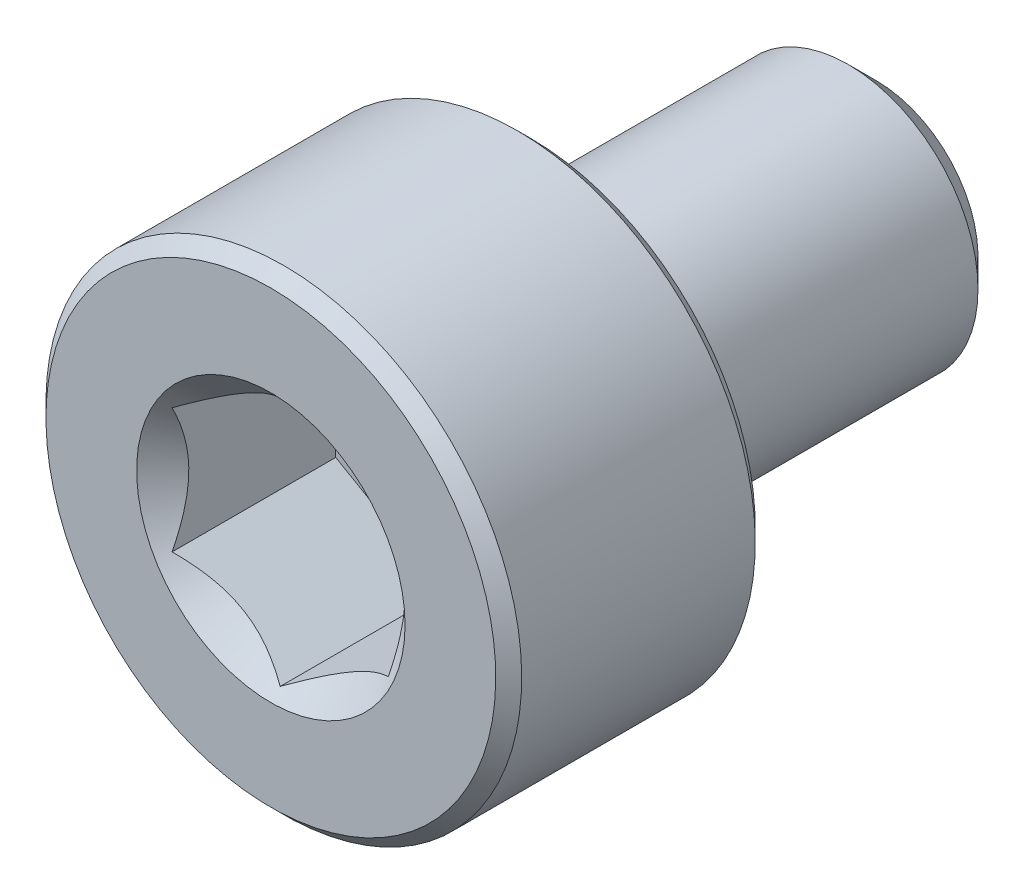
ISO-10303-21;
HEADER;
FILE_DESCRIPTION(('STEP AP214'),'2;1');
FILE_NAME('part.step','',(''),(''),'','','');
FILE_SCHEMA(('AUTOMOTIVE_DESIGN { 1 0 10303 214 1 1 1 1 }'));
ENDSEC;
DATA;
#1=APPLICATION_CONTEXT('core data for automotive mechanical design processes');
#2=APPLICATION_PROTOCOL_DEFINITION('international standard','automotive_design',2000,#1);
#3=PRODUCT_CONTEXT('',#1,'mechanical');
#4=PRODUCT('Part','Part','',(#3));
#5=PRODUCT_RELATED_PRODUCT_CATEGORY('part','',(#4));
#6=PRODUCT_DEFINITION_FORMATION('','',#4);
#7=PRODUCT_DEFINITION_CONTEXT('part definition',#1,'design');
#8=PRODUCT_DEFINITION('design','',#6,#7);
#9=PRODUCT_DEFINITION_SHAPE('','',#8);
#10=(LENGTH_UNIT() NAMED_UNIT(*) SI_UNIT(.MILLI.,.METRE.));
#11=(NAMED_UNIT(*) PLANE_ANGLE_UNIT() SI_UNIT($,.RADIAN.));
#12=(NAMED_UNIT(*) SI_UNIT($,.STERADIAN.) SOLID_ANGLE_UNIT());
#13=UNCERTAINTY_MEASURE_WITH_UNIT(LENGTH_MEASURE(1.E-05),#10,'distance_accuracy_value','');
#14=(GEOMETRIC_REPRESENTATION_CONTEXT(3) GLOBAL_UNCERTAINTY_ASSIGNED_CONTEXT((#13)) GLOBAL_UNIT_ASSIGNED_CONTEXT((#10,
#11,#12)) REPRESENTATION_CONTEXT('',''));
#15=CARTESIAN_POINT('',(0.,0.,0.));
#16=DIRECTION('',(0.,0.,1.));
#17=DIRECTION('',(1.,0.,0.));
#18=AXIS2_PLACEMENT_3D('',#15,#16,#17);
#19=CARTESIAN_POINT('',(0.,1.17524047358084,-3.5));
#20=DIRECTION('',(0.,0.,-1.));
#21=DIRECTION('',(0.,1.,0.));
#22=AXIS2_PLACEMENT_3D('',#19,#20,#21);
#23=PLANE('',#22);
#24=CARTESIAN_POINT('',(0.,0.,-3.5));
#25=DIRECTION('',(0.,0.,-1.));
#26=DIRECTION('',(0.,1.,0.));
#27=AXIS2_PLACEMENT_3D('',#24,#25,#26);
#28=CIRCLE('',#27,1.17524047358084);
#29=CARTESIAN_POINT('',(0.,1.17524047358084,-3.5));
#30=VERTEX_POINT('',#29);
#31=EDGE_CURVE('E55',#30,#30,#28,.T.);
#32=ORIENTED_EDGE('',*,*,#31,.T.);
#33=EDGE_LOOP('',(#32));
#34=FACE_BOUND('',#33,.T.);
#35=ADVANCED_FACE('F41',(#34),#23,.T.);
#36=CARTESIAN_POINT('',(0.,0.,-3.5));
#37=DIRECTION('',(0.,0.,1.));
#38=DIRECTION('',(0.,-1.,0.));
#39=AXIS2_PLACEMENT_3D('',#36,#37,#38);
#40=CONICAL_SURFACE('',#39,1.17524047358084,0.785398163397446);
#41=CARTESIAN_POINT('',(0.,0.,-3.17524047358083));
#42=DIRECTION('',(0.,0.,-1.));
#43=DIRECTION('',(0.,1.,0.));
#44=AXIS2_PLACEMENT_3D('',#41,#42,#43);
#45=CIRCLE('',#44,1.5);
#46=CARTESIAN_POINT('',(0.,1.5,-3.17524047358083));
#47=VERTEX_POINT('',#46);
#48=EDGE_CURVE('E173',#47,#47,#45,.T.);
#49=ORIENTED_EDGE('',*,*,#48,.T.);
#50=EDGE_LOOP('',(#49));
#51=FACE_BOUND('',#50,.T.);
#52=ORIENTED_EDGE('',*,*,#31,.F.);
#53=EDGE_LOOP('',(#52));
#54=FACE_BOUND('',#53,.T.);
#55=ADVANCED_FACE('F181',(#51,#54),#40,.T.);
#56=CARTESIAN_POINT('',(0.,0.,-3.5));
#57=DIRECTION('',(0.,0.,-1.));
#58=DIRECTION('',(0.,1.,0.));
#59=AXIS2_PLACEMENT_3D('',#56,#57,#58);
#60=CYLINDRICAL_SURFACE('',#59,1.5);
#61=CARTESIAN_POINT('',(0.,0.,0.349999999999998));
#62=DIRECTION('',(0.,0.,-1.));
#63=DIRECTION('',(0.,1.,0.));
#64=AXIS2_PLACEMENT_3D('',#61,#62,#63);
#65=CIRCLE('',#64,1.5);
#66=CARTESIAN_POINT('',(0.,1.5,0.349999999999998));
#67=VERTEX_POINT('',#66);
#68=EDGE_CURVE('E169',#67,#67,#65,.T.);
#69=ORIENTED_EDGE('',*,*,#68,.T.);
#70=EDGE_LOOP('',(#69));
#71=FACE_BOUND('',#70,.T.);
#72=ORIENTED_EDGE('',*,*,#48,.F.);
#73=EDGE_LOOP('',(#72));
#74=FACE_BOUND('',#73,.T.);
#75=ADVANCED_FACE('F183',(#71,#74),#60,.T.);
#76=CARTESIAN_POINT('',(0.,0.,0.349999999999998));
#77=DIRECTION('',(0.,0.,-1.));
#78=DIRECTION('',(0.,1.,0.));
#79=AXIS2_PLACEMENT_3D('',#76,#77,#78);
#80=TOROIDAL_SURFACE('',#79,1.65,0.15);
#81=CARTESIAN_POINT('',(0.,0.,0.499999999999999));
#82=DIRECTION('',(0.,0.,-1.));
#83=DIRECTION('',(0.,1.,0.));
#84=AXIS2_PLACEMENT_3D('',#81,#82,#83);
#85=CIRCLE('',#84,1.65);
#86=CARTESIAN_POINT('',(0.,1.65,0.499999999999999));
#87=VERTEX_POINT('',#86);
#88=EDGE_CURVE('E165',#87,#87,#85,.T.);
#89=ORIENTED_EDGE('',*,*,#88,.T.);
#90=EDGE_LOOP('',(#89));
#91=FACE_BOUND('',#90,.T.);
#92=ORIENTED_EDGE('',*,*,#68,.F.);
#93=EDGE_LOOP('',(#92));
#94=FACE_BOUND('',#93,.T.);
#95=ADVANCED_FACE('F189',(#91,#94),#80,.F.);
#96=CARTESIAN_POINT('',(0.,2.6,0.5));
#97=DIRECTION('',(0.,0.,-1.));
#98=DIRECTION('',(0.,1.,0.));
#99=AXIS2_PLACEMENT_3D('',#96,#97,#98);
#100=PLANE('',#99);
#101=CARTESIAN_POINT('',(0.,0.,0.5));
#102=DIRECTION('',(0.,0.,-1.));
#103=DIRECTION('',(0.,1.,0.));
#104=AXIS2_PLACEMENT_3D('',#101,#102,#103);
#105=CIRCLE('',#104,2.6);
#106=CARTESIAN_POINT('',(0.,2.6,0.5));
#107=VERTEX_POINT('',#106);
#108=EDGE_CURVE('E161',#107,#107,#105,.T.);
#109=ORIENTED_EDGE('',*,*,#108,.T.);
#110=EDGE_LOOP('',(#109));
#111=FACE_BOUND('',#110,.T.);
#112=ORIENTED_EDGE('',*,*,#88,.F.);
#113=EDGE_LOOP('',(#112));
#114=FACE_BOUND('',#113,.T.);
#115=ADVANCED_FACE('F195',(#111,#114),#100,.T.);
#116=CARTESIAN_POINT('',(0.,0.,0.5));
#117=DIRECTION('',(0.,0.,1.));
#118=DIRECTION('',(0.,-1.,0.));
#119=AXIS2_PLACEMENT_3D('',#116,#117,#118);
#120=CONICAL_SURFACE('',#119,2.6,0.785398163397448);
#121=CARTESIAN_POINT('',(0.,0.,0.65));
#122=DIRECTION('',(0.,0.,-1.));
#123=DIRECTION('',(0.,1.,0.));
#124=AXIS2_PLACEMENT_3D('',#121,#122,#123);
#125=CIRCLE('',#124,2.75);
#126=CARTESIAN_POINT('',(0.,2.75,0.65));
#127=VERTEX_POINT('',#126);
#128=EDGE_CURVE('E157',#127,#127,#125,.T.);
#129=ORIENTED_EDGE('',*,*,#128,.T.);
#130=EDGE_LOOP('',(#129));
#131=FACE_BOUND('',#130,.T.);
#132=ORIENTED_EDGE('',*,*,#108,.F.);
#133=EDGE_LOOP('',(#132));
#134=FACE_BOUND('',#133,.T.);
#135=ADVANCED_FACE('F199',(#131,#134),#120,.T.);
#136=CARTESIAN_POINT('',(0.,0.,-3.5));
#137=DIRECTION('',(0.,0.,-1.));
#138=DIRECTION('',(0.,1.,0.));
#139=AXIS2_PLACEMENT_3D('',#136,#137,#138);
#140=CYLINDRICAL_SURFACE('',#139,2.75);
#141=CARTESIAN_POINT('',(0.,0.,3.35));
#142=DIRECTION('',(0.,0.,-1.));
#143=DIRECTION('',(0.,1.,0.));
#144=AXIS2_PLACEMENT_3D('',#141,#142,#143);
#145=CIRCLE('',#144,2.75);
#146=CARTESIAN_POINT('',(0.,2.75,3.35));
#147=VERTEX_POINT('',#146);
#148=EDGE_CURVE('E153',#147,#147,#145,.T.);
#149=ORIENTED_EDGE('',*,*,#148,.T.);
#150=EDGE_LOOP('',(#149));
#151=FACE_BOUND('',#150,.T.);
#152=ORIENTED_EDGE('',*,*,#128,.F.);
#153=EDGE_LOOP('',(#152));
#154=FACE_BOUND('',#153,.T.);
#155=ADVANCED_FACE('F203',(#151,#154),#140,.T.);
#156=CARTESIAN_POINT('',(0.,0.,3.35));
#157=DIRECTION('',(0.,0.,-1.));
#158=DIRECTION('',(0.,1.,0.));
#159=AXIS2_PLACEMENT_3D('',#156,#157,#158);
#160=CONICAL_SURFACE('',#159,2.75,0.785398163397451);
#161=CARTESIAN_POINT('',(0.,0.,3.5));
#162=DIRECTION('',(0.,0.,-1.));
#163=DIRECTION('',(0.,1.,0.));
#164=AXIS2_PLACEMENT_3D('',#161,#162,#163);
#165=CIRCLE('',#164,2.6);
#166=CARTESIAN_POINT('',(0.,2.6,3.5));
#167=VERTEX_POINT('',#166);
#168=EDGE_CURVE('E149',#167,#167,#165,.T.);
#169=ORIENTED_EDGE('',*,*,#168,.T.);
#170=EDGE_LOOP('',(#169));
#171=FACE_BOUND('',#170,.T.);
#172=ORIENTED_EDGE('',*,*,#148,.F.);
#173=EDGE_LOOP('',(#172));
#174=FACE_BOUND('',#173,.T.);
#175=ADVANCED_FACE('F207',(#171,#174),#160,.T.);
#176=CARTESIAN_POINT('',(0.,0.,3.5));
#177=DIRECTION('',(0.,0.,1.));
#178=DIRECTION('',(0.,-1.,0.));
#179=AXIS2_PLACEMENT_3D('',#176,#177,#178);
#180=PLANE('',#179);
#181=CARTESIAN_POINT('',(0.,0.,3.5));
#182=DIRECTION('',(0.,0.,1.));
#183=DIRECTION('',(1.,0.,0.));
#184=AXIS2_PLACEMENT_3D('',#181,#182,#183);
#185=CIRCLE('',#184,1.55162884844712);
#186=CARTESIAN_POINT('',(1.55162884844712,0.,3.5));
#187=VERTEX_POINT('',#186);
#188=EDGE_CURVE('E115',#187,#187,#185,.T.);
#189=ORIENTED_EDGE('',*,*,#188,.F.);
#190=EDGE_LOOP('',(#189));
#191=FACE_BOUND('',#190,.T.);
#192=ORIENTED_EDGE('',*,*,#168,.F.);
#193=EDGE_LOOP('',(#192));
#194=FACE_BOUND('',#193,.T.);
#195=ADVANCED_FACE('F211',(#191,#194),#180,.T.);
#196=CARTESIAN_POINT('',(0.,0.,3.5));
#197=DIRECTION('',(0.,0.,1.));
#198=DIRECTION('',(1.,0.,0.));
#199=AXIS2_PLACEMENT_3D('',#196,#197,#198);
#200=CONICAL_SURFACE('',#199,1.55162884844712,0.78539816339745);
#201=ORIENTED_EDGE('',*,*,#188,.T.);
#202=EDGE_LOOP('',(#201));
#203=FACE_BOUND('',#202,.T.);
#204=CARTESIAN_POINT('',(-0.000199999999999194,-1.4434911430279,3.39186230843608));
#205=CARTESIAN_POINT('',(0.0427751670715875,-1.41867941875065,3.36706849258205));
#206=CARTESIAN_POINT('',(0.0864690047459488,-1.39345276980743,3.34373055894563));
#207=CARTESIAN_POINT('',(0.175565930841943,-1.34201263554194,3.30099882861148));
#208=CARTESIAN_POINT('',(0.220977498357065,-1.31579425481276,3.28162881688736));
#209=CARTESIAN_POINT('',(0.312547820935261,-1.26292610442246,3.24844730794042));
#210=CARTESIAN_POINT('',(0.358683240175887,-1.23628980770471,3.2345523835796));
#211=CARTESIAN_POINT('',(0.451970080407593,-1.18243062538508,3.21314410668758));
#212=CARTESIAN_POINT('',(0.49911864913638,-1.15520938653761,3.20561476609373));
#213=CARTESIAN_POINT('',(0.580373556887253,-1.10829684367467,3.19882132257765));
#214=CARTESIAN_POINT('',(0.614374876627942,-1.08866617256958,3.1978153836313));
#215=CARTESIAN_POINT('',(0.682317764432478,-1.04943932800611,3.19950823943826));
#216=CARTESIAN_POINT('',(0.716259317655658,-1.02984316311599,3.20220785174248));
#217=CARTESIAN_POINT('',(0.7838148564575,-0.990839954603499,3.21115575484332));
#218=CARTESIAN_POINT('',(0.817428507286776,-0.971433104248771,3.21740735042665));
#219=CARTESIAN_POINT('',(0.884094638217814,-0.932943395609905,3.23312250594085));
#220=CARTESIAN_POINT('',(0.917146871030296,-0.9138606800983,3.2425874446144));
#221=CARTESIAN_POINT('',(1.00179969160026,-0.864986351354568,3.27067821521453));
#222=CARTESIAN_POINT('',(1.05286649242964,-0.835502920149076,3.29141698197915));
#223=CARTESIAN_POINT('',(1.15300085411326,-0.777690319475908,3.33813395919842));
#224=CARTESIAN_POINT('',(1.20207431157827,-0.749357745598417,3.36409512047371));
#225=CARTESIAN_POINT('',(1.2502,-0.721572366433195,3.39186230843608));
#226=B_SPLINE_CURVE_WITH_KNOTS('',3,(#204,#205,#206,#207,#208,#209,#210,#211,#212,#213,#214,
#215,#216,#217,#218,#219,#220,#221,#222,#223,#224,#225),.UNSPECIFIED.,.F.,.F.,(4,2,2,2,2,2,2,2,
2,2,4),(0.,0.166533409618304,0.334037607289762,0.498880396489698,0.663307919240274,
0.780963963458826,0.898645970148452,1.01643764860773,1.13427993171549,1.32148652032141,
1.50809158792573),.UNSPECIFIED.);
#227=CARTESIAN_POINT('',(0.,-1.44337567297406,3.39174682452695));
#228=VERTEX_POINT('',#227);
#229=CARTESIAN_POINT('',(1.25,-0.721687836487032,3.39174682452695));
#230=VERTEX_POINT('',#229);
#231=EDGE_CURVE('E12',#228,#230,#226,.T.);
#232=ORIENTED_EDGE('',*,*,#231,.F.);
#233=CARTESIAN_POINT('',(-1.2502,-0.721572366433195,3.39186230843608));
#234=CARTESIAN_POINT('',(-1.20722483292841,-0.746384090710444,3.36706849258205));
#235=CARTESIAN_POINT('',(-1.16353099525405,-0.771610739653664,3.34373055894563));
#236=CARTESIAN_POINT('',(-1.07443406915806,-0.823050873919155,3.30099882861148));
#237=CARTESIAN_POINT('',(-1.02902250164294,-0.849269254648333,3.28162881688736));
#238=CARTESIAN_POINT('',(-0.93745217906474,-0.902137405038635,3.24844730794042));
#239=CARTESIAN_POINT('',(-0.891316759824115,-0.928773701756387,3.2345523835796));
#240=CARTESIAN_POINT('',(-0.798029919592408,-0.982632884076012,3.21314410668758));
#241=CARTESIAN_POINT('',(-0.75088135086362,-1.00985412292348,3.20561476609373));
#242=CARTESIAN_POINT('',(-0.669626443112748,-1.05676666578643,3.19882132257765));
#243=CARTESIAN_POINT('',(-0.635625123372059,-1.07639733689152,3.1978153836313));
#244=CARTESIAN_POINT('',(-0.567682235567523,-1.11562418145499,3.19950823943826));
#245=CARTESIAN_POINT('',(-0.533740682344343,-1.1352203463451,3.20220785174248));
#246=CARTESIAN_POINT('',(-0.466185143542501,-1.1742235548576,3.21115575484332));
#247=CARTESIAN_POINT('',(-0.432571492713225,-1.19363040521233,3.21740735042665));
#248=CARTESIAN_POINT('',(-0.365905361782187,-1.23212011385119,3.23312250594085));
#249=CARTESIAN_POINT('',(-0.332853128969705,-1.2512028293628,3.2425874446144));
#250=CARTESIAN_POINT('',(-0.248200308399736,-1.30007715810653,3.27067821521453));
#251=CARTESIAN_POINT('',(-0.197133507570361,-1.32956058931202,3.29141698197915));
#252=CARTESIAN_POINT('',(-0.0969991458867445,-1.38737318998519,3.33813395919842));
#253=CARTESIAN_POINT('',(-0.0479256884217298,-1.41570576386268,3.36409512047371));
#254=CARTESIAN_POINT('',(0.000200000000000913,-1.4434911430279,3.39186230843608));
#255=B_SPLINE_CURVE_WITH_KNOTS('',3,(#233,#234,#235,#236,#237,#238,#239,#240,#241,#242,#243,
#244,#245,#246,#247,#248,#249,#250,#251,#252,#253,#254),.UNSPECIFIED.,.F.,.F.,(4,2,2,2,2,2,2,2,
2,2,4),(0.,0.166533409618303,0.334037607289761,0.498880396489698,0.663307919240274,
0.780963963458826,0.898645970148452,1.01643764860773,1.13427993171549,1.32148652032141,
1.50809158792574),.UNSPECIFIED.);
#256=CARTESIAN_POINT('',(-1.25,-0.721687836487032,3.39174682452695));
#257=VERTEX_POINT('',#256);
#258=EDGE_CURVE('E100',#257,#228,#255,.T.);
#259=ORIENTED_EDGE('',*,*,#258,.F.);
#260=CARTESIAN_POINT('',(-1.25,-1.52022146239345,3.91651070319084));
#261=CARTESIAN_POINT('',(-1.25,-1.48354689134962,3.88818689718723));
#262=CARTESIAN_POINT('',(-1.25,-1.44667707589305,3.86011672093047));
#263=CARTESIAN_POINT('',(-1.25,-1.37246477804769,3.80459065501776));
#264=CARTESIAN_POINT('',(-1.25,-1.33512218721453,3.77713491044787));
#265=CARTESIAN_POINT('',(-1.25,-1.22171630832114,3.69545809771049));
#266=CARTESIAN_POINT('',(-1.25,-1.14482995781092,3.6423614251193));
#267=CARTESIAN_POINT('',(-1.25,-0.983056768942586,3.53734973416941));
#268=CARTESIAN_POINT('',(-1.25,-0.897974111811056,3.48573326925832));
#269=CARTESIAN_POINT('',(-1.25,-0.723462355215555,3.39078355108508));
#270=CARTESIAN_POINT('',(-1.25,-0.634049271919706,3.34742232185916));
#271=CARTESIAN_POINT('',(-1.25,-0.5005887711437,3.29435177040724));
#272=CARTESIAN_POINT('',(-1.25,-0.45869172620811,3.27926501327173));
#273=CARTESIAN_POINT('',(-1.25,-0.373815329706778,3.25244749770266));
#274=CARTESIAN_POINT('',(-1.25,-0.330835910419723,3.24071694982871));
#275=CARTESIAN_POINT('',(-1.25,-0.244810833071148,3.22144313304601));
#276=CARTESIAN_POINT('',(-1.25,-0.20178270746757,3.21382289169454));
#277=CARTESIAN_POINT('',(-1.25,-0.115176247984994,3.20293190707962));
#278=CARTESIAN_POINT('',(-1.25,-0.0715980347745593,3.1996602260857));
#279=CARTESIAN_POINT('',(-1.25,0.0136806197531969,3.19775210045869));
#280=CARTESIAN_POINT('',(-1.25,0.0553765370047051,3.19891205716704));
#281=CARTESIAN_POINT('',(-1.25,0.13844909645316,3.20533266388464));
#282=CARTESIAN_POINT('',(-1.25,0.179825709781942,3.21059368038276));
#283=CARTESIAN_POINT('',(-1.25,0.262662840763599,3.22500574721218));
#284=CARTESIAN_POINT('',(-1.25,0.304111120669651,3.23422600730023));
#285=CARTESIAN_POINT('',(-1.25,0.386089884230835,3.25604235623938));
#286=CARTESIAN_POINT('',(-1.25,0.426620414510369,3.26863827317792));
#287=CARTESIAN_POINT('',(-1.25,0.550794781768362,3.3120595916479));
#288=CARTESIAN_POINT('',(-1.25,0.632755591043412,3.34768282700966));
#289=CARTESIAN_POINT('',(-1.25,0.792852508946383,3.42696814455953));
#290=CARTESIAN_POINT('',(-1.25,0.870973935410876,3.47065844211049));
#291=CARTESIAN_POINT('',(-1.25,1.02031328199646,3.56088158787621));
#292=CARTESIAN_POINT('',(-1.25,1.09168171050215,3.60716845879521));
#293=CARTESIAN_POINT('',(-1.25,1.19682802849918,3.67876149953673));
#294=CARTESIAN_POINT('',(-1.25,1.2314248214359,3.70288582787532));
#295=CARTESIAN_POINT('',(-1.25,1.30014350643268,3.75178258410313));
#296=CARTESIAN_POINT('',(-1.25,1.33426552680451,3.7765548314612));
#297=CARTESIAN_POINT('',(-1.25,1.36818950249276,3.8015960474388));
#298=B_SPLINE_CURVE_WITH_KNOTS('',3,(#260,#261,#262,#263,#264,#265,#266,#267,#268,#269,#270,
#271,#272,#273,#274,#275,#276,#277,#278,#279,#280,#281,#282,#283,#284,#285,#286,#287,#288,#289,
#290,#291,#292,#293,#294,#295,#296,#297),.UNSPECIFIED.,.F.,.F.,(4,2,2,2,2,2,2,2,2,2,2,2,2,2,2,2,
2,2,4),(0.,0.139012369615043,0.278057225136917,0.55825950405377,0.856585057342473,
1.15388088887298,1.28736138903992,1.42085026158167,1.55174393609413,1.68260937990424,
1.80753647715252,1.93247473971975,2.05969207441603,2.18690293152764,2.45422704655832,
2.72250450232039,2.97756898823762,3.10409578574714,3.23058769667827),.UNSPECIFIED.);
#299=CARTESIAN_POINT('',(-1.25,0.721687836487032,3.39174682452695));
#300=VERTEX_POINT('',#299);
#301=EDGE_CURVE('E114',#300,#257,#298,.F.);
#302=ORIENTED_EDGE('',*,*,#301,.F.);
#303=CARTESIAN_POINT('',(0.000199999999999644,1.4434911430279,3.39186230843608));
#304=CARTESIAN_POINT('',(-0.0427751670715871,1.41867941875065,3.36706849258205));
#305=CARTESIAN_POINT('',(-0.0864690047459484,1.39345276980743,3.34373055894563));
#306=CARTESIAN_POINT('',(-0.175565930841942,1.34201263554194,3.30099882861148));
#307=CARTESIAN_POINT('',(-0.220977498357064,1.31579425481276,3.28162881688736));
#308=CARTESIAN_POINT('',(-0.31254782093526,1.26292610442246,3.24844730794042));
#309=CARTESIAN_POINT('',(-0.358683240175886,1.23628980770471,3.2345523835796));
#310=CARTESIAN_POINT('',(-0.451970080407592,1.18243062538508,3.21314410668758));
#311=CARTESIAN_POINT('',(-0.49911864913638,1.15520938653761,3.20561476609373));
#312=CARTESIAN_POINT('',(-0.580373556887252,1.10829684367467,3.19882132257765));
#313=CARTESIAN_POINT('',(-0.614374876627941,1.08866617256958,3.1978153836313));
#314=CARTESIAN_POINT('',(-0.682317764432477,1.04943932800611,3.19950823943826));
#315=CARTESIAN_POINT('',(-0.716259317655657,1.02984316311599,3.20220785174248));
#316=CARTESIAN_POINT('',(-0.783814856457499,0.990839954603499,3.21115575484332));
#317=CARTESIAN_POINT('',(-0.817428507286775,0.971433104248771,3.21740735042665));
#318=CARTESIAN_POINT('',(-0.884094638217813,0.932943395609905,3.23312250594085));
#319=CARTESIAN_POINT('',(-0.917146871030295,0.9138606800983,3.2425874446144));
#320=CARTESIAN_POINT('',(-1.00179969160026,0.864986351354567,3.27067821521453));
#321=CARTESIAN_POINT('',(-1.05286649242964,0.835502920149075,3.29141698197915));
#322=CARTESIAN_POINT('',(-1.15300085411325,0.777690319475908,3.33813395919842));
#323=CARTESIAN_POINT('',(-1.20207431157827,0.749357745598416,3.36409512047371));
#324=CARTESIAN_POINT('',(-1.2502,0.721572366433194,3.39186230843608));
#325=B_SPLINE_CURVE_WITH_KNOTS('',3,(#303,#304,#305,#306,#307,#308,#309,#310,#311,#312,#313,
#314,#315,#316,#317,#318,#319,#320,#321,#322,#323,#324),.UNSPECIFIED.,.F.,.F.,(4,2,2,2,2,2,2,2,
2,2,4),(0.,0.166533409618304,0.334037607289761,0.498880396489698,0.663307919240274,
0.780963963458826,0.898645970148452,1.01643764860773,1.13427993171549,1.32148652032141,
1.50809158792574),.UNSPECIFIED.);
#326=CARTESIAN_POINT('',(0.,1.44337567297406,3.39174682452695));
#327=VERTEX_POINT('',#326);
#328=EDGE_CURVE('E262',#327,#300,#325,.T.);
#329=ORIENTED_EDGE('',*,*,#328,.F.);
#330=CARTESIAN_POINT('',(1.2502,0.721572366433194,3.39186230843608));
#331=CARTESIAN_POINT('',(1.20722483292841,0.746384090710444,3.36706849258205));
#332=CARTESIAN_POINT('',(1.16353099525405,0.771610739653664,3.34373055894563));
#333=CARTESIAN_POINT('',(1.07443406915806,0.823050873919155,3.30099882861148));
#334=CARTESIAN_POINT('',(1.02902250164294,0.849269254648333,3.28162881688736));
#335=CARTESIAN_POINT('',(0.93745217906474,0.902137405038635,3.24844730794042));
#336=CARTESIAN_POINT('',(0.891316759824115,0.928773701756387,3.2345523835796));
#337=CARTESIAN_POINT('',(0.798029919592408,0.982632884076012,3.21314410668758));
#338=CARTESIAN_POINT('',(0.75088135086362,1.00985412292348,3.20561476609373));
#339=CARTESIAN_POINT('',(0.669626443112748,1.05676666578643,3.19882132257765));
#340=CARTESIAN_POINT('',(0.635625123372059,1.07639733689152,3.1978153836313));
#341=CARTESIAN_POINT('',(0.567682235567523,1.11562418145499,3.19950823943826));
#342=CARTESIAN_POINT('',(0.533740682344343,1.1352203463451,3.20220785174248));
#343=CARTESIAN_POINT('',(0.466185143542501,1.1742235548576,3.21115575484332));
#344=CARTESIAN_POINT('',(0.432571492713225,1.19363040521233,3.21740735042665));
#345=CARTESIAN_POINT('',(0.365905361782187,1.23212011385119,3.23312250594085));
#346=CARTESIAN_POINT('',(0.332853128969705,1.2512028293628,3.2425874446144));
#347=CARTESIAN_POINT('',(0.248200308399736,1.30007715810653,3.27067821521453));
#348=CARTESIAN_POINT('',(0.197133507570362,1.32956058931202,3.29141698197915));
#349=CARTESIAN_POINT('',(0.096999145886745,1.38737318998519,3.33813395919842));
#350=CARTESIAN_POINT('',(0.0479256884217303,1.41570576386268,3.36409512047371));
#351=CARTESIAN_POINT('',(-0.000200000000000291,1.4434911430279,3.39186230843608));
#352=B_SPLINE_CURVE_WITH_KNOTS('',3,(#330,#331,#332,#333,#334,#335,#336,#337,#338,#339,#340,
#341,#342,#343,#344,#345,#346,#347,#348,#349,#350,#351),.UNSPECIFIED.,.F.,.F.,(4,2,2,2,2,2,2,2,
2,2,4),(0.,0.166533409618304,0.334037607289762,0.498880396489698,0.663307919240274,
0.780963963458826,0.898645970148452,1.01643764860773,1.13427993171549,1.32148652032141,
1.50809158792574),.UNSPECIFIED.);
#353=CARTESIAN_POINT('',(1.25,0.721687836487032,3.39174682452695));
#354=VERTEX_POINT('',#353);
#355=EDGE_CURVE('E235',#354,#327,#352,.T.);
#356=ORIENTED_EDGE('',*,*,#355,.F.);
#357=CARTESIAN_POINT('',(1.25,-1.52022146239345,3.91651070319084));
#358=CARTESIAN_POINT('',(1.25,-1.48354689134962,3.88818689718723));
#359=CARTESIAN_POINT('',(1.25,-1.44667707589305,3.86011672093047));
#360=CARTESIAN_POINT('',(1.25,-1.37246477804769,3.80459065501776));
#361=CARTESIAN_POINT('',(1.25,-1.33512218721453,3.77713491044787));
#362=CARTESIAN_POINT('',(1.25,-1.22171630832114,3.69545809771049));
#363=CARTESIAN_POINT('',(1.25,-1.14482995781092,3.6423614251193));
#364=CARTESIAN_POINT('',(1.25,-0.983056768942587,3.53734973416941));
#365=CARTESIAN_POINT('',(1.25,-0.897974111811056,3.48573326925832));
#366=CARTESIAN_POINT('',(1.25,-0.723462355215555,3.39078355108508));
#367=CARTESIAN_POINT('',(1.25,-0.634049271919706,3.34742232185916));
#368=CARTESIAN_POINT('',(1.25,-0.500588771143699,3.29435177040724));
#369=CARTESIAN_POINT('',(1.25,-0.45869172620811,3.27926501327173));
#370=CARTESIAN_POINT('',(1.25,-0.373815329706778,3.25244749770266));
#371=CARTESIAN_POINT('',(1.25,-0.330835910419723,3.24071694982871));
#372=CARTESIAN_POINT('',(1.25,-0.244810833071148,3.22144313304601));
#373=CARTESIAN_POINT('',(1.25,-0.20178270746757,3.21382289169454));
#374=CARTESIAN_POINT('',(1.25,-0.115176247984994,3.20293190707962));
#375=CARTESIAN_POINT('',(1.25,-0.0715980347745594,3.1996602260857));
#376=CARTESIAN_POINT('',(1.25,0.0136806197531967,3.19775210045869));
#377=CARTESIAN_POINT('',(1.25,0.0553765370047048,3.19891205716704));
#378=CARTESIAN_POINT('',(1.25,0.13844909645316,3.20533266388464));
#379=CARTESIAN_POINT('',(1.25,0.179825709781942,3.21059368038276));
#380=CARTESIAN_POINT('',(1.25,0.262662840763599,3.22500574721218));
#381=CARTESIAN_POINT('',(1.25,0.304111120669651,3.23422600730023));
#382=CARTESIAN_POINT('',(1.25,0.386089884230834,3.25604235623938));
#383=CARTESIAN_POINT('',(1.25,0.426620414510369,3.26863827317792));
#384=CARTESIAN_POINT('',(1.25,0.550794781768362,3.3120595916479));
#385=CARTESIAN_POINT('',(1.25,0.632755591043412,3.34768282700966));
#386=CARTESIAN_POINT('',(1.25,0.792852508946383,3.42696814455953));
#387=CARTESIAN_POINT('',(1.25,0.870973935410876,3.47065844211049));
#388=CARTESIAN_POINT('',(1.25,1.02031328199646,3.56088158787621));
#389=CARTESIAN_POINT('',(1.25,1.09168171050215,3.60716845879521));
#390=CARTESIAN_POINT('',(1.25,1.19682802849918,3.67876149953673));
#391=CARTESIAN_POINT('',(1.25,1.2314248214359,3.70288582787532));
#392=CARTESIAN_POINT('',(1.25,1.30014350643268,3.75178258410313));
#393=CARTESIAN_POINT('',(1.25,1.33426552680451,3.7765548314612));
#394=CARTESIAN_POINT('',(1.25,1.36818950249276,3.8015960474388));
#395=B_SPLINE_CURVE_WITH_KNOTS('',3,(#357,#358,#359,#360,#361,#362,#363,#364,#365,#366,#367,
#368,#369,#370,#371,#372,#373,#374,#375,#376,#377,#378,#379,#380,#381,#382,#383,#384,#385,#386,
#387,#388,#389,#390,#391,#392,#393,#394),.UNSPECIFIED.,.F.,.F.,(4,2,2,2,2,2,2,2,2,2,2,2,2,2,2,2,
2,2,4),(0.,0.139012369615044,0.278057225136917,0.55825950405377,0.856585057342473,
1.15388088887299,1.28736138903992,1.42085026158167,1.55174393609413,1.68260937990424,
1.80753647715252,1.93247473971975,2.05969207441603,2.18690293152764,2.45422704655832,
2.72250450232039,2.97756898823762,3.10409578574714,3.23058769667827),.UNSPECIFIED.);
#396=EDGE_CURVE('E62',#230,#354,#395,.T.);
#397=ORIENTED_EDGE('',*,*,#396,.F.);
#398=EDGE_LOOP('',(#232,#259,#302,#329,#356,#397));
#399=FACE_BOUND('',#398,.T.);
#400=ADVANCED_FACE('F99',(#203,#399),#200,.F.);
#401=CARTESIAN_POINT('',(0.,2.6,1.5));
#402=DIRECTION('',(0.,0.,-1.));
#403=DIRECTION('',(0.,1.,0.));
#404=AXIS2_PLACEMENT_3D('',#401,#402,#403);
#405=PLANE('',#404);
#406=DIRECTION('',(0.866025403784438,0.5,0.));
#407=VECTOR('',#406,1.);
#408=CARTESIAN_POINT('',(0.,-1.44337567297406,1.5));
#409=LINE('',#408,#407);
#410=CARTESIAN_POINT('',(0.,-1.44337567297406,1.5));
#411=VERTEX_POINT('',#410);
#412=CARTESIAN_POINT('',(1.25,-0.721687836487032,1.5));
#413=VERTEX_POINT('',#412);
#414=EDGE_CURVE('E118',#411,#413,#409,.T.);
#415=ORIENTED_EDGE('',*,*,#414,.T.);
#416=DIRECTION('',(0.,1.,0.));
#417=VECTOR('',#416,1.);
#418=CARTESIAN_POINT('',(1.25,-0.721687836487032,1.5));
#419=LINE('',#418,#417);
#420=CARTESIAN_POINT('',(1.25,0.721687836487032,1.5));
#421=VERTEX_POINT('',#420);
#422=EDGE_CURVE('E69',#413,#421,#419,.T.);
#423=ORIENTED_EDGE('',*,*,#422,.T.);
#424=DIRECTION('',(-0.866025403784439,0.5,0.));
#425=VECTOR('',#424,1.);
#426=CARTESIAN_POINT('',(1.25,0.721687836487032,1.5));
#427=LINE('',#426,#425);
#428=CARTESIAN_POINT('',(0.,1.44337567297406,1.5));
#429=VERTEX_POINT('',#428);
#430=EDGE_CURVE('E129',#421,#429,#427,.T.);
#431=ORIENTED_EDGE('',*,*,#430,.T.);
#432=DIRECTION('',(-0.866025403784439,-0.5,0.));
#433=VECTOR('',#432,1.);
#434=CARTESIAN_POINT('',(0.,1.44337567297406,1.5));
#435=LINE('',#434,#433);
#436=CARTESIAN_POINT('',(-1.25,0.721687836487032,1.5));
#437=VERTEX_POINT('',#436);
#438=EDGE_CURVE('E138',#429,#437,#435,.T.);
#439=ORIENTED_EDGE('',*,*,#438,.T.);
#440=DIRECTION('',(0.,-1.,0.));
#441=VECTOR('',#440,1.);
#442=CARTESIAN_POINT('',(-1.25,0.721687836487032,1.5));
#443=LINE('',#442,#441);
#444=CARTESIAN_POINT('',(-1.25,-0.721687836487033,1.5));
#445=VERTEX_POINT('',#444);
#446=EDGE_CURVE('E133',#437,#445,#443,.T.);
#447=ORIENTED_EDGE('',*,*,#446,.T.);
#448=DIRECTION('',(0.866025403784439,-0.5,0.));
#449=VECTOR('',#448,1.);
#450=CARTESIAN_POINT('',(-1.25,-0.721687836487032,1.5));
#451=LINE('',#450,#449);
#452=EDGE_CURVE('E120',#445,#411,#451,.T.);
#453=ORIENTED_EDGE('',*,*,#452,.T.);
#454=EDGE_LOOP('',(#415,#423,#431,#439,#447,#453));
#455=FACE_BOUND('',#454,.T.);
#456=ADVANCED_FACE('F216',(#455),#405,.F.);
#457=CARTESIAN_POINT('',(0.,-1.44337567297406,-3.31881307912987));
#458=DIRECTION('',(0.5,-0.866025403784438,0.));
#459=DIRECTION('',(0.866025403784438,0.5,0.));
#460=AXIS2_PLACEMENT_3D('',#457,#458,#459);
#461=PLANE('',#460);
#462=DIRECTION('',(0.,0.,1.));
#463=VECTOR('',#462,1.);
#464=CARTESIAN_POINT('',(0.,-1.44337567297406,-3.31881307912987));
#465=LINE('',#464,#463);
#466=EDGE_CURVE('E109',#411,#228,#465,.T.);
#467=ORIENTED_EDGE('',*,*,#466,.T.);
#468=ORIENTED_EDGE('',*,*,#231,.T.);
#469=DIRECTION('',(0.,0.,1.));
#470=VECTOR('',#469,1.);
#471=CARTESIAN_POINT('',(1.25,-0.721687836487032,-3.31881307912987));
#472=LINE('',#471,#470);
#473=EDGE_CURVE('E124',#413,#230,#472,.T.);
#474=ORIENTED_EDGE('',*,*,#473,.F.);
#475=ORIENTED_EDGE('',*,*,#414,.F.);
#476=EDGE_LOOP('',(#467,#468,#474,#475));
#477=FACE_BOUND('',#476,.T.);
#478=ADVANCED_FACE('F117',(#477),#461,.F.);
#479=CARTESIAN_POINT('',(-1.25,-0.721687836487032,-3.31881307912987));
#480=DIRECTION('',(-0.5,-0.866025403784439,0.));
#481=DIRECTION('',(0.866025403784439,-0.5,0.));
#482=AXIS2_PLACEMENT_3D('',#479,#480,#481);
#483=PLANE('',#482);
#484=DIRECTION('',(0.,0.,1.));
#485=VECTOR('',#484,1.);
#486=CARTESIAN_POINT('',(-1.25,-0.721687836487032,-3.31881307912987));
#487=LINE('',#486,#485);
#488=EDGE_CURVE('E112',#445,#257,#487,.T.);
#489=ORIENTED_EDGE('',*,*,#488,.T.);
#490=ORIENTED_EDGE('',*,*,#258,.T.);
#491=ORIENTED_EDGE('',*,*,#466,.F.);
#492=ORIENTED_EDGE('',*,*,#452,.F.);
#493=EDGE_LOOP('',(#489,#490,#491,#492));
#494=FACE_BOUND('',#493,.T.);
#495=ADVANCED_FACE('F108',(#494),#483,.F.);
#496=CARTESIAN_POINT('',(-1.25,0.721687836487032,-3.31881307912987));
#497=DIRECTION('',(-1.,0.,0.));
#498=DIRECTION('',(0.,0.,1.));
#499=AXIS2_PLACEMENT_3D('',#496,#497,#498);
#500=PLANE('',#499);
#501=DIRECTION('',(0.,0.,1.));
#502=VECTOR('',#501,1.);
#503=CARTESIAN_POINT('',(-1.25,0.721687836487032,-3.31881307912987));
#504=LINE('',#503,#502);
#505=EDGE_CURVE('E134',#437,#300,#504,.T.);
#506=ORIENTED_EDGE('',*,*,#505,.T.);
#507=ORIENTED_EDGE('',*,*,#301,.T.);
#508=ORIENTED_EDGE('',*,*,#488,.F.);
#509=ORIENTED_EDGE('',*,*,#446,.F.);
#510=EDGE_LOOP('',(#506,#507,#508,#509));
#511=FACE_BOUND('',#510,.T.);
#512=ADVANCED_FACE('F272',(#511),#500,.F.);
#513=CARTESIAN_POINT('',(0.,1.44337567297406,-3.31881307912987));
#514=DIRECTION('',(-0.5,0.866025403784438,0.));
#515=DIRECTION('',(-0.866025403784439,-0.5,0.));
#516=AXIS2_PLACEMENT_3D('',#513,#514,#515);
#517=PLANE('',#516);
#518=DIRECTION('',(0.,0.,1.));
#519=VECTOR('',#518,1.);
#520=CARTESIAN_POINT('',(0.,1.44337567297406,-3.31881307912987));
#521=LINE('',#520,#519);
#522=EDGE_CURVE('E139',#429,#327,#521,.T.);
#523=ORIENTED_EDGE('',*,*,#522,.T.);
#524=ORIENTED_EDGE('',*,*,#328,.T.);
#525=ORIENTED_EDGE('',*,*,#505,.F.);
#526=ORIENTED_EDGE('',*,*,#438,.F.);
#527=EDGE_LOOP('',(#523,#524,#525,#526));
#528=FACE_BOUND('',#527,.T.);
#529=ADVANCED_FACE('F269',(#528),#517,.F.);
#530=CARTESIAN_POINT('',(1.25,0.721687836487032,-3.31881307912987));
#531=DIRECTION('',(0.5,0.866025403784439,0.));
#532=DIRECTION('',(-0.866025403784439,0.5,0.));
#533=AXIS2_PLACEMENT_3D('',#530,#531,#532);
#534=PLANE('',#533);
#535=DIRECTION('',(0.,0.,1.));
#536=VECTOR('',#535,1.);
#537=CARTESIAN_POINT('',(1.25,0.721687836487032,-3.31881307912987));
#538=LINE('',#537,#536);
#539=EDGE_CURVE('E143',#421,#354,#538,.T.);
#540=ORIENTED_EDGE('',*,*,#539,.T.);
#541=ORIENTED_EDGE('',*,*,#355,.T.);
#542=ORIENTED_EDGE('',*,*,#522,.F.);
#543=ORIENTED_EDGE('',*,*,#430,.F.);
#544=EDGE_LOOP('',(#540,#541,#542,#543));
#545=FACE_BOUND('',#544,.T.);
#546=ADVANCED_FACE('F224',(#545),#534,.F.);
#547=CARTESIAN_POINT('',(1.25,-0.721687836487032,-3.31881307912987));
#548=DIRECTION('',(1.,0.,0.));
#549=DIRECTION('',(0.,0.,-1.));
#550=AXIS2_PLACEMENT_3D('',#547,#548,#549);
#551=PLANE('',#550);
#552=ORIENTED_EDGE('',*,*,#473,.T.);
#553=ORIENTED_EDGE('',*,*,#396,.T.);
#554=ORIENTED_EDGE('',*,*,#539,.F.);
#555=ORIENTED_EDGE('',*,*,#422,.F.);
#556=EDGE_LOOP('',(#552,#553,#554,#555));
#557=FACE_BOUND('',#556,.T.);
#558=ADVANCED_FACE('F220',(#557),#551,.F.);
#559=CLOSED_SHELL('',(#35,#55,#75,#95,#115,#135,#155,#175,#195,#400,#456,#478,#495,#512,#529,
#546,#558));
#560=MANIFOLD_SOLID_BREP('B2',#559);
#561=ADVANCED_BREP_SHAPE_REPRESENTATION('',(#18,#560),#14);
#562=SHAPE_DEFINITION_REPRESENTATION(#9,#561);
ENDSEC;
END-ISO-10303-21;
